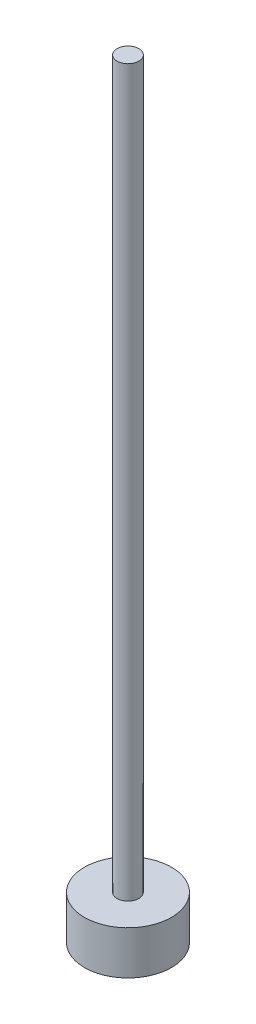
ISO-10303-21;
HEADER;
FILE_DESCRIPTION(('STEP AP214'),'2;1');
FILE_NAME('part.step','',(''),(''),'','','');
FILE_SCHEMA(('AUTOMOTIVE_DESIGN { 1 0 10303 214 1 1 1 1 }'));
ENDSEC;
DATA;
#1=APPLICATION_CONTEXT('core data for automotive mechanical design processes');
#2=APPLICATION_PROTOCOL_DEFINITION('international standard','automotive_design',2000,#1);
#3=PRODUCT_CONTEXT('',#1,'mechanical');
#4=PRODUCT('Part','Part','',(#3));
#5=PRODUCT_RELATED_PRODUCT_CATEGORY('part','',(#4));
#6=PRODUCT_DEFINITION_FORMATION('','',#4);
#7=PRODUCT_DEFINITION_CONTEXT('part definition',#1,'design');
#8=PRODUCT_DEFINITION('design','',#6,#7);
#9=PRODUCT_DEFINITION_SHAPE('','',#8);
#10=(LENGTH_UNIT() NAMED_UNIT(*) SI_UNIT(.MILLI.,.METRE.));
#11=(NAMED_UNIT(*) PLANE_ANGLE_UNIT() SI_UNIT($,.RADIAN.));
#12=(NAMED_UNIT(*) SI_UNIT($,.STERADIAN.) SOLID_ANGLE_UNIT());
#13=UNCERTAINTY_MEASURE_WITH_UNIT(LENGTH_MEASURE(1.E-05),#10,'distance_accuracy_value','');
#14=(GEOMETRIC_REPRESENTATION_CONTEXT(3) GLOBAL_UNCERTAINTY_ASSIGNED_CONTEXT((#13)) GLOBAL_UNIT_ASSIGNED_CONTEXT((#10,
#11,#12)) REPRESENTATION_CONTEXT('',''));
#15=CARTESIAN_POINT('',(0.,0.,0.));
#16=DIRECTION('',(0.,0.,1.));
#17=DIRECTION('',(1.,0.,0.));
#18=AXIS2_PLACEMENT_3D('',#15,#16,#17);
#19=CARTESIAN_POINT('',(0.,3.,0.));
#20=DIRECTION('',(0.,-1.,0.));
#21=DIRECTION('',(0.,0.,-1.));
#22=AXIS2_PLACEMENT_3D('',#19,#20,#21);
#23=CYLINDRICAL_SURFACE('',#22,3.);
#24=CARTESIAN_POINT('',(0.,3.,0.));
#25=DIRECTION('',(0.,1.,0.));
#26=DIRECTION('',(0.,0.,1.));
#27=AXIS2_PLACEMENT_3D('',#24,#25,#26);
#28=CIRCLE('',#27,3.);
#29=CARTESIAN_POINT('',(0.,3.,3.));
#30=VERTEX_POINT('',#29);
#31=EDGE_CURVE('E49',#30,#30,#28,.T.);
#32=ORIENTED_EDGE('',*,*,#31,.F.);
#33=EDGE_LOOP('',(#32));
#34=FACE_BOUND('',#33,.T.);
#35=CARTESIAN_POINT('',(0.,0.,0.));
#36=DIRECTION('',(0.,1.,0.));
#37=DIRECTION('',(0.,0.,1.));
#38=AXIS2_PLACEMENT_3D('',#35,#36,#37);
#39=CIRCLE('',#38,3.);
#40=CARTESIAN_POINT('',(0.,0.,3.));
#41=VERTEX_POINT('',#40);
#42=EDGE_CURVE('E44',#41,#41,#39,.T.);
#43=ORIENTED_EDGE('',*,*,#42,.T.);
#44=EDGE_LOOP('',(#43));
#45=FACE_BOUND('',#44,.T.);
#46=ADVANCED_FACE('F41',(#34,#45),#23,.T.);
#47=CARTESIAN_POINT('',(0.,3.,0.));
#48=DIRECTION('',(0.,1.,0.));
#49=DIRECTION('',(0.,0.,1.));
#50=AXIS2_PLACEMENT_3D('',#47,#48,#49);
#51=PLANE('',#50);
#52=CARTESIAN_POINT('',(0.,3.,0.));
#53=DIRECTION('',(0.,1.,0.));
#54=DIRECTION('',(0.,0.,1.));
#55=AXIS2_PLACEMENT_3D('',#52,#53,#54);
#56=CIRCLE('',#55,0.75);
#57=CARTESIAN_POINT('',(0.,3.,0.75));
#58=VERTEX_POINT('',#57);
#59=EDGE_CURVE('E10',#58,#58,#56,.T.);
#60=ORIENTED_EDGE('',*,*,#59,.F.);
#61=EDGE_LOOP('',(#60));
#62=FACE_BOUND('',#61,.T.);
#63=ORIENTED_EDGE('',*,*,#31,.T.);
#64=EDGE_LOOP('',(#63));
#65=FACE_BOUND('',#64,.T.);
#66=ADVANCED_FACE('F69',(#62,#65),#51,.T.);
#67=CARTESIAN_POINT('',(0.,0.,0.));
#68=DIRECTION('',(0.,1.,0.));
#69=DIRECTION('',(0.,0.,1.));
#70=AXIS2_PLACEMENT_3D('',#67,#68,#69);
#71=PLANE('',#70);
#72=ORIENTED_EDGE('',*,*,#42,.F.);
#73=EDGE_LOOP('',(#72));
#74=FACE_BOUND('',#73,.T.);
#75=ADVANCED_FACE('F66',(#74),#71,.F.);
#76=CARTESIAN_POINT('',(0.,53.,0.));
#77=DIRECTION('',(0.,-1.,0.));
#78=DIRECTION('',(0.,0.,-1.));
#79=AXIS2_PLACEMENT_3D('',#76,#77,#78);
#80=CYLINDRICAL_SURFACE('',#79,0.75);
#81=CARTESIAN_POINT('',(0.,53.,0.));
#82=DIRECTION('',(0.,1.,0.));
#83=DIRECTION('',(0.,0.,1.));
#84=AXIS2_PLACEMENT_3D('',#81,#82,#83);
#85=CIRCLE('',#84,0.75);
#86=CARTESIAN_POINT('',(0.,53.,0.75));
#87=VERTEX_POINT('',#86);
#88=EDGE_CURVE('E56',#87,#87,#85,.T.);
#89=ORIENTED_EDGE('',*,*,#88,.F.);
#90=EDGE_LOOP('',(#89));
#91=FACE_BOUND('',#90,.T.);
#92=ORIENTED_EDGE('',*,*,#59,.T.);
#93=EDGE_LOOP('',(#92));
#94=FACE_BOUND('',#93,.T.);
#95=ADVANCED_FACE('F68',(#91,#94),#80,.T.);
#96=CARTESIAN_POINT('',(0.,53.,0.));
#97=DIRECTION('',(0.,1.,0.));
#98=DIRECTION('',(0.,0.,1.));
#99=AXIS2_PLACEMENT_3D('',#96,#97,#98);
#100=PLANE('',#99);
#101=ORIENTED_EDGE('',*,*,#88,.T.);
#102=EDGE_LOOP('',(#101));
#103=FACE_BOUND('',#102,.T.);
#104=ADVANCED_FACE('F74',(#103),#100,.T.);
#105=CLOSED_SHELL('',(#46,#66,#75,#95,#104));
#106=MANIFOLD_SOLID_BREP('B2',#105);
#107=ADVANCED_BREP_SHAPE_REPRESENTATION('',(#18,#106),#14);
#108=SHAPE_DEFINITION_REPRESENTATION(#9,#107);
ENDSEC;
END-ISO-10303-21;
